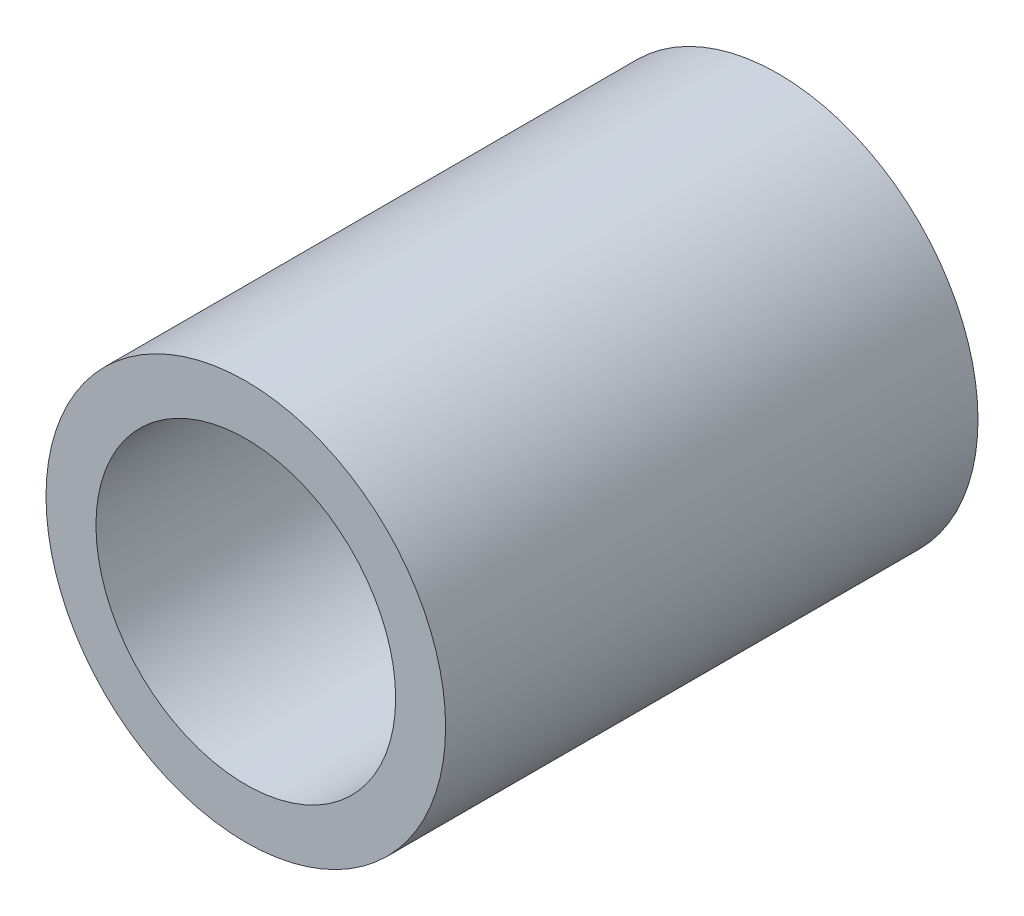
ISO-10303-21;
HEADER;
FILE_DESCRIPTION(('STEP AP214'),'2;1');
FILE_NAME('part.step','',(''),(''),'','','');
FILE_SCHEMA(('AUTOMOTIVE_DESIGN { 1 0 10303 214 1 1 1 1 }'));
ENDSEC;
DATA;
#1=APPLICATION_CONTEXT('core data for automotive mechanical design processes');
#2=APPLICATION_PROTOCOL_DEFINITION('international standard','automotive_design',2000,#1);
#3=PRODUCT_CONTEXT('',#1,'mechanical');
#4=PRODUCT('Part','Part','',(#3));
#5=PRODUCT_RELATED_PRODUCT_CATEGORY('part','',(#4));
#6=PRODUCT_DEFINITION_FORMATION('','',#4);
#7=PRODUCT_DEFINITION_CONTEXT('part definition',#1,'design');
#8=PRODUCT_DEFINITION('design','',#6,#7);
#9=PRODUCT_DEFINITION_SHAPE('','',#8);
#10=(LENGTH_UNIT() NAMED_UNIT(*) SI_UNIT(.MILLI.,.METRE.));
#11=(NAMED_UNIT(*) PLANE_ANGLE_UNIT() SI_UNIT($,.RADIAN.));
#12=(NAMED_UNIT(*) SI_UNIT($,.STERADIAN.) SOLID_ANGLE_UNIT());
#13=UNCERTAINTY_MEASURE_WITH_UNIT(LENGTH_MEASURE(1.E-05),#10,'distance_accuracy_value','');
#14=(GEOMETRIC_REPRESENTATION_CONTEXT(3) GLOBAL_UNCERTAINTY_ASSIGNED_CONTEXT((#13)) GLOBAL_UNIT_ASSIGNED_CONTEXT((#10,
#11,#12)) REPRESENTATION_CONTEXT('',''));
#15=CARTESIAN_POINT('',(0.,0.,0.));
#16=DIRECTION('',(0.,0.,1.));
#17=DIRECTION('',(1.,0.,0.));
#18=AXIS2_PLACEMENT_3D('',#15,#16,#17);
#19=CARTESIAN_POINT('',(0.,0.,25.38125));
#20=DIRECTION('',(0.,0.,1.));
#21=DIRECTION('',(1.,0.,0.));
#22=AXIS2_PLACEMENT_3D('',#19,#20,#21);
#23=PLANE('',#22);
#24=CARTESIAN_POINT('',(0.,0.,25.38125));
#25=DIRECTION('',(0.,0.,1.));
#26=DIRECTION('',(1.,0.,0.));
#27=AXIS2_PLACEMENT_3D('',#24,#25,#26);
#28=CIRCLE('',#27,9.525);
#29=CARTESIAN_POINT('',(9.525,0.,25.38125));
#30=VERTEX_POINT('',#29);
#31=EDGE_CURVE('E10',#30,#30,#28,.T.);
#32=ORIENTED_EDGE('',*,*,#31,.T.);
#33=EDGE_LOOP('',(#32));
#34=FACE_BOUND('',#33,.T.);
#35=CARTESIAN_POINT('',(0.,0.,25.38125));
#36=DIRECTION('',(0.,0.,1.));
#37=DIRECTION('',(1.,0.,0.));
#38=AXIS2_PLACEMENT_3D('',#35,#36,#37);
#39=CIRCLE('',#38,7.14375);
#40=CARTESIAN_POINT('',(7.14375,0.,25.38125));
#41=VERTEX_POINT('',#40);
#42=EDGE_CURVE('E43',#41,#41,#39,.T.);
#43=ORIENTED_EDGE('',*,*,#42,.F.);
#44=EDGE_LOOP('',(#43));
#45=FACE_BOUND('',#44,.T.);
#46=ADVANCED_FACE('F32',(#34,#45),#23,.T.);
#47=CARTESIAN_POINT('',(0.,0.,0.));
#48=DIRECTION('',(0.,0.,1.));
#49=DIRECTION('',(1.,0.,0.));
#50=AXIS2_PLACEMENT_3D('',#47,#48,#49);
#51=PLANE('',#50);
#52=CARTESIAN_POINT('',(0.,0.,0.));
#53=DIRECTION('',(0.,0.,1.));
#54=DIRECTION('',(1.,0.,0.));
#55=AXIS2_PLACEMENT_3D('',#52,#53,#54);
#56=CIRCLE('',#55,9.525);
#57=CARTESIAN_POINT('',(9.525,0.,0.));
#58=VERTEX_POINT('',#57);
#59=EDGE_CURVE('E36',#58,#58,#56,.T.);
#60=ORIENTED_EDGE('',*,*,#59,.F.);
#61=EDGE_LOOP('',(#60));
#62=FACE_BOUND('',#61,.T.);
#63=CARTESIAN_POINT('',(0.,0.,0.));
#64=DIRECTION('',(0.,0.,1.));
#65=DIRECTION('',(1.,0.,0.));
#66=AXIS2_PLACEMENT_3D('',#63,#64,#65);
#67=CIRCLE('',#66,7.14375);
#68=CARTESIAN_POINT('',(7.14375,0.,0.));
#69=VERTEX_POINT('',#68);
#70=EDGE_CURVE('E45',#69,#69,#67,.T.);
#71=ORIENTED_EDGE('',*,*,#70,.T.);
#72=EDGE_LOOP('',(#71));
#73=FACE_BOUND('',#72,.T.);
#74=ADVANCED_FACE('F55',(#62,#73),#51,.F.);
#75=CARTESIAN_POINT('',(0.,0.,25.38125));
#76=DIRECTION('',(0.,0.,-1.));
#77=DIRECTION('',(-1.,0.,0.));
#78=AXIS2_PLACEMENT_3D('',#75,#76,#77);
#79=CYLINDRICAL_SURFACE('',#78,9.525);
#80=ORIENTED_EDGE('',*,*,#31,.F.);
#81=EDGE_LOOP('',(#80));
#82=FACE_BOUND('',#81,.T.);
#83=ORIENTED_EDGE('',*,*,#59,.T.);
#84=EDGE_LOOP('',(#83));
#85=FACE_BOUND('',#84,.T.);
#86=ADVANCED_FACE('F34',(#82,#85),#79,.T.);
#87=CARTESIAN_POINT('',(0.,0.,25.38125));
#88=DIRECTION('',(0.,0.,-1.));
#89=DIRECTION('',(-1.,0.,0.));
#90=AXIS2_PLACEMENT_3D('',#87,#88,#89);
#91=CYLINDRICAL_SURFACE('',#90,7.14375);
#92=ORIENTED_EDGE('',*,*,#42,.T.);
#93=EDGE_LOOP('',(#92));
#94=FACE_BOUND('',#93,.T.);
#95=ORIENTED_EDGE('',*,*,#70,.F.);
#96=EDGE_LOOP('',(#95));
#97=FACE_BOUND('',#96,.T.);
#98=ADVANCED_FACE('F51',(#94,#97),#91,.F.);
#99=CLOSED_SHELL('',(#46,#74,#86,#98));
#100=MANIFOLD_SOLID_BREP('B2',#99);
#101=ADVANCED_BREP_SHAPE_REPRESENTATION('',(#18,#100),#14);
#102=SHAPE_DEFINITION_REPRESENTATION(#9,#101);
ENDSEC;
END-ISO-10303-21;
